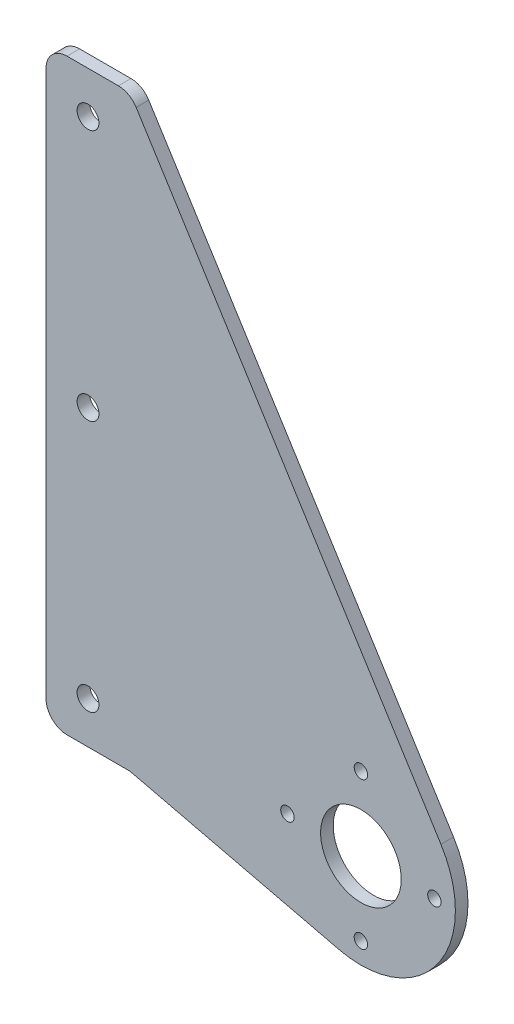
ISO-10303-21;
HEADER;
FILE_DESCRIPTION(('STEP AP214'),'2;1');
FILE_NAME('part.step','',(''),(''),'','','');
FILE_SCHEMA(('AUTOMOTIVE_DESIGN { 1 0 10303 214 1 1 1 1 }'));
ENDSEC;
DATA;
#1=APPLICATION_CONTEXT('core data for automotive mechanical design processes');
#2=APPLICATION_PROTOCOL_DEFINITION('international standard','automotive_design',2000,#1);
#3=PRODUCT_CONTEXT('',#1,'mechanical');
#4=PRODUCT('Part','Part','',(#3));
#5=PRODUCT_RELATED_PRODUCT_CATEGORY('part','',(#4));
#6=PRODUCT_DEFINITION_FORMATION('','',#4);
#7=PRODUCT_DEFINITION_CONTEXT('part definition',#1,'design');
#8=PRODUCT_DEFINITION('design','',#6,#7);
#9=PRODUCT_DEFINITION_SHAPE('','',#8);
#10=(LENGTH_UNIT() NAMED_UNIT(*) SI_UNIT(.MILLI.,.METRE.));
#11=(NAMED_UNIT(*) PLANE_ANGLE_UNIT() SI_UNIT($,.RADIAN.));
#12=(NAMED_UNIT(*) SI_UNIT($,.STERADIAN.) SOLID_ANGLE_UNIT());
#13=UNCERTAINTY_MEASURE_WITH_UNIT(LENGTH_MEASURE(1.E-05),#10,'distance_accuracy_value','');
#14=(GEOMETRIC_REPRESENTATION_CONTEXT(3) GLOBAL_UNCERTAINTY_ASSIGNED_CONTEXT((#13)) GLOBAL_UNIT_ASSIGNED_CONTEXT((#10,
#11,#12)) REPRESENTATION_CONTEXT('',''));
#15=CARTESIAN_POINT('',(0.,0.,0.));
#16=DIRECTION('',(0.,0.,1.));
#17=DIRECTION('',(1.,0.,0.));
#18=AXIS2_PLACEMENT_3D('',#15,#16,#17);
#19=CARTESIAN_POINT('',(0.,0.,3.));
#20=DIRECTION('',(0.,0.,1.));
#21=DIRECTION('',(1.,0.,0.));
#22=AXIS2_PLACEMENT_3D('',#19,#20,#21);
#23=PLANE('',#22);
#24=CARTESIAN_POINT('',(-65.,120.,3.));
#25=DIRECTION('',(0.,0.,1.));
#26=DIRECTION('',(1.,0.,0.));
#27=AXIS2_PLACEMENT_3D('',#24,#25,#26);
#28=CIRCLE('',#27,2.59999999999997);
#29=CARTESIAN_POINT('',(-62.4,120.,3.));
#30=VERTEX_POINT('',#29);
#31=EDGE_CURVE('E343',#30,#30,#28,.T.);
#32=ORIENTED_EDGE('',*,*,#31,.F.);
#33=EDGE_LOOP('',(#32));
#34=FACE_BOUND('',#33,.T.);
#35=CARTESIAN_POINT('',(-17.5,0.,3.));
#36=DIRECTION('',(0.,0.,1.));
#37=DIRECTION('',(1.,0.,0.));
#38=AXIS2_PLACEMENT_3D('',#35,#36,#37);
#39=CIRCLE('',#38,1.6);
#40=CARTESIAN_POINT('',(-15.9,0.,3.));
#41=VERTEX_POINT('',#40);
#42=EDGE_CURVE('E327',#41,#41,#39,.T.);
#43=ORIENTED_EDGE('',*,*,#42,.F.);
#44=EDGE_LOOP('',(#43));
#45=FACE_BOUND('',#44,.T.);
#46=CARTESIAN_POINT('',(17.5,0.,3.));
#47=DIRECTION('',(0.,0.,1.));
#48=DIRECTION('',(1.,0.,0.));
#49=AXIS2_PLACEMENT_3D('',#46,#47,#48);
#50=CIRCLE('',#49,1.60000000000001);
#51=CARTESIAN_POINT('',(19.1,0.,3.));
#52=VERTEX_POINT('',#51);
#53=EDGE_CURVE('E311',#52,#52,#50,.T.);
#54=ORIENTED_EDGE('',*,*,#53,.F.);
#55=EDGE_LOOP('',(#54));
#56=FACE_BOUND('',#55,.T.);
#57=CARTESIAN_POINT('',(0.,0.,3.));
#58=DIRECTION('',(0.,0.,1.));
#59=DIRECTION('',(1.,0.,0.));
#60=AXIS2_PLACEMENT_3D('',#57,#58,#59);
#61=CIRCLE('',#60,9.6);
#62=CARTESIAN_POINT('',(9.6,0.,3.));
#63=VERTEX_POINT('',#62);
#64=EDGE_CURVE('E163',#63,#63,#61,.T.);
#65=ORIENTED_EDGE('',*,*,#64,.F.);
#66=EDGE_LOOP('',(#65));
#67=FACE_BOUND('',#66,.T.);
#68=DIRECTION('',(-0.53145870163887,0.847084203873692,0.));
#69=VECTOR('',#68,1.);
#70=CARTESIAN_POINT('',(-55.,130.,3.));
#71=LINE('',#70,#69);
#72=CARTESIAN_POINT('',(19.0593945871581,11.9578207868746,3.));
#73=VERTEX_POINT('',#72);
#74=CARTESIAN_POINT('',(-53.5301912787863,127.657293508194,3.));
#75=VERTEX_POINT('',#74);
#76=EDGE_CURVE('E152',#73,#75,#71,.T.);
#77=ORIENTED_EDGE('',*,*,#76,.T.);
#78=CARTESIAN_POINT('',(-57.7656122981547,125.,3.));
#79=DIRECTION('',(0.,0.,1.));
#80=DIRECTION('',(1.,0.,0.));
#81=AXIS2_PLACEMENT_3D('',#78,#79,#80);
#82=CIRCLE('',#81,5.);
#83=CARTESIAN_POINT('',(-57.7656122981547,130.,3.));
#84=VERTEX_POINT('',#83);
#85=EDGE_CURVE('E215',#75,#84,#82,.T.);
#86=ORIENTED_EDGE('',*,*,#85,.T.);
#87=DIRECTION('',(-1.,0.,0.));
#88=VECTOR('',#87,1.);
#89=CARTESIAN_POINT('',(-75.,130.,3.));
#90=LINE('',#89,#88);
#91=CARTESIAN_POINT('',(-70.,130.,3.));
#92=VERTEX_POINT('',#91);
#93=EDGE_CURVE('E179',#84,#92,#90,.T.);
#94=ORIENTED_EDGE('',*,*,#93,.T.);
#95=CARTESIAN_POINT('',(-70.,125.,3.));
#96=DIRECTION('',(0.,0.,1.));
#97=DIRECTION('',(1.,0.,0.));
#98=AXIS2_PLACEMENT_3D('',#95,#96,#97);
#99=CIRCLE('',#98,5.);
#100=CARTESIAN_POINT('',(-75.,125.,3.));
#101=VERTEX_POINT('',#100);
#102=EDGE_CURVE('E68',#92,#101,#99,.T.);
#103=ORIENTED_EDGE('',*,*,#102,.T.);
#104=DIRECTION('',(0.,-1.,0.));
#105=VECTOR('',#104,1.);
#106=CARTESIAN_POINT('',(-75.,130.,3.));
#107=LINE('',#106,#105);
#108=CARTESIAN_POINT('',(-75.,-5.,3.));
#109=VERTEX_POINT('',#108);
#110=EDGE_CURVE('E285',#101,#109,#107,.T.);
#111=ORIENTED_EDGE('',*,*,#110,.T.);
#112=CARTESIAN_POINT('',(-70.,-5.00000000000001,3.));
#113=DIRECTION('',(0.,0.,1.));
#114=DIRECTION('',(1.,0.,0.));
#115=AXIS2_PLACEMENT_3D('',#112,#113,#114);
#116=CIRCLE('',#115,5.);
#117=CARTESIAN_POINT('',(-70.,-10.,3.));
#118=VERTEX_POINT('',#117);
#119=EDGE_CURVE('E212',#109,#118,#116,.T.);
#120=ORIENTED_EDGE('',*,*,#119,.T.);
#121=DIRECTION('',(1.,0.,0.));
#122=VECTOR('',#121,1.);
#123=CARTESIAN_POINT('',(-75.,-10.,3.));
#124=LINE('',#123,#122);
#125=CARTESIAN_POINT('',(-55.5886578882851,-10.,3.));
#126=VERTEX_POINT('',#125);
#127=EDGE_CURVE('E135',#118,#126,#124,.T.);
#128=ORIENTED_EDGE('',*,*,#127,.T.);
#129=CARTESIAN_POINT('',(-55.5886578882851,-15.,3.));
#130=DIRECTION('',(0.,0.,1.));
#131=DIRECTION('',(1.,0.,0.));
#132=AXIS2_PLACEMENT_3D('',#129,#130,#131);
#133=CIRCLE('',#132,5.);
#134=CARTESIAN_POINT('',(-54.4274374679034,-10.1367123120991,3.));
#135=VERTEX_POINT('',#134);
#136=EDGE_CURVE('E11',#126,#135,#133,.F.);
#137=ORIENTED_EDGE('',*,*,#136,.T.);
#138=DIRECTION('',(0.972657537580184,-0.23224408407633,0.));
#139=VECTOR('',#138,1.);
#140=CARTESIAN_POINT('',(-55.,-10.,3.));
#141=LINE('',#140,#139);
#142=CARTESIAN_POINT('',(-5.22549189171743,-21.8847945955541,3.));
#143=VERTEX_POINT('',#142);
#144=EDGE_CURVE('E122',#135,#143,#141,.T.);
#145=ORIENTED_EDGE('',*,*,#144,.T.);
#146=CARTESIAN_POINT('',(0.,0.,3.));
#147=DIRECTION('',(0.,0.,1.));
#148=DIRECTION('',(1.,0.,0.));
#149=AXIS2_PLACEMENT_3D('',#146,#147,#148);
#150=CIRCLE('',#149,22.5);
#151=EDGE_CURVE('E127',#143,#73,#150,.T.);
#152=ORIENTED_EDGE('',*,*,#151,.T.);
#153=EDGE_LOOP('',(#77,#86,#94,#103,#111,#120,#128,#137,#145,#152));
#154=FACE_BOUND('',#153,.T.);
#155=CARTESIAN_POINT('',(0.,17.5,3.));
#156=DIRECTION('',(0.,0.,1.));
#157=DIRECTION('',(1.,0.,0.));
#158=AXIS2_PLACEMENT_3D('',#155,#156,#157);
#159=CIRCLE('',#158,1.6);
#160=CARTESIAN_POINT('',(1.60000000000005,17.5,3.));
#161=VERTEX_POINT('',#160);
#162=EDGE_CURVE('E303',#161,#161,#159,.T.);
#163=ORIENTED_EDGE('',*,*,#162,.F.);
#164=EDGE_LOOP('',(#163));
#165=FACE_BOUND('',#164,.T.);
#166=CARTESIAN_POINT('',(0.,-17.5,3.));
#167=DIRECTION('',(0.,0.,1.));
#168=DIRECTION('',(1.,0.,0.));
#169=AXIS2_PLACEMENT_3D('',#166,#167,#168);
#170=CIRCLE('',#169,1.6);
#171=CARTESIAN_POINT('',(1.59999999999994,-17.5,3.));
#172=VERTEX_POINT('',#171);
#173=EDGE_CURVE('E319',#172,#172,#170,.T.);
#174=ORIENTED_EDGE('',*,*,#173,.F.);
#175=EDGE_LOOP('',(#174));
#176=FACE_BOUND('',#175,.T.);
#177=CARTESIAN_POINT('',(-65.,60.,3.));
#178=DIRECTION('',(0.,0.,1.));
#179=DIRECTION('',(1.,0.,0.));
#180=AXIS2_PLACEMENT_3D('',#177,#178,#179);
#181=CIRCLE('',#180,2.59999999999999);
#182=CARTESIAN_POINT('',(-62.4,60.,3.));
#183=VERTEX_POINT('',#182);
#184=EDGE_CURVE('E335',#183,#183,#181,.T.);
#185=ORIENTED_EDGE('',*,*,#184,.F.);
#186=EDGE_LOOP('',(#185));
#187=FACE_BOUND('',#186,.T.);
#188=CARTESIAN_POINT('',(-65.,0.,3.));
#189=DIRECTION('',(0.,0.,1.));
#190=DIRECTION('',(1.,0.,0.));
#191=AXIS2_PLACEMENT_3D('',#188,#189,#190);
#192=CIRCLE('',#191,2.59999999999999);
#193=CARTESIAN_POINT('',(-62.4,0.,3.));
#194=VERTEX_POINT('',#193);
#195=EDGE_CURVE('E351',#194,#194,#192,.T.);
#196=ORIENTED_EDGE('',*,*,#195,.F.);
#197=EDGE_LOOP('',(#196));
#198=FACE_BOUND('',#197,.T.);
#199=ADVANCED_FACE('F45',(#34,#45,#56,#67,#154,#165,#176,#187,#198),#23,.T.);
#200=CARTESIAN_POINT('',(0.,0.,0.));
#201=DIRECTION('',(0.,0.,1.));
#202=DIRECTION('',(1.,0.,0.));
#203=AXIS2_PLACEMENT_3D('',#200,#201,#202);
#204=PLANE('',#203);
#205=DIRECTION('',(-1.,0.,0.));
#206=VECTOR('',#205,1.);
#207=CARTESIAN_POINT('',(-75.,130.,0.));
#208=LINE('',#207,#206);
#209=CARTESIAN_POINT('',(-57.7656122981547,130.,0.));
#210=VERTEX_POINT('',#209);
#211=CARTESIAN_POINT('',(-70.,130.,0.));
#212=VERTEX_POINT('',#211);
#213=EDGE_CURVE('E158',#210,#212,#208,.T.);
#214=ORIENTED_EDGE('',*,*,#213,.F.);
#215=CARTESIAN_POINT('',(-57.7656122981547,125.,0.));
#216=DIRECTION('',(0.,0.,1.));
#217=DIRECTION('',(1.,0.,0.));
#218=AXIS2_PLACEMENT_3D('',#215,#216,#217);
#219=CIRCLE('',#218,5.);
#220=CARTESIAN_POINT('',(-53.5301912787863,127.657293508194,0.));
#221=VERTEX_POINT('',#220);
#222=EDGE_CURVE('E204',#210,#221,#219,.F.);
#223=ORIENTED_EDGE('',*,*,#222,.T.);
#224=DIRECTION('',(-0.53145870163887,0.847084203873692,0.));
#225=VECTOR('',#224,1.);
#226=CARTESIAN_POINT('',(-55.,130.,0.));
#227=LINE('',#226,#225);
#228=CARTESIAN_POINT('',(19.0593945871581,11.9578207868746,0.));
#229=VERTEX_POINT('',#228);
#230=EDGE_CURVE('E175',#229,#221,#227,.T.);
#231=ORIENTED_EDGE('',*,*,#230,.F.);
#232=CARTESIAN_POINT('',(0.,0.,0.));
#233=DIRECTION('',(0.,0.,1.));
#234=DIRECTION('',(1.,0.,0.));
#235=AXIS2_PLACEMENT_3D('',#232,#233,#234);
#236=CIRCLE('',#235,22.5);
#237=CARTESIAN_POINT('',(-5.22549189171743,-21.8847945955541,0.));
#238=VERTEX_POINT('',#237);
#239=EDGE_CURVE('E172',#238,#229,#236,.T.);
#240=ORIENTED_EDGE('',*,*,#239,.F.);
#241=DIRECTION('',(0.972657537580184,-0.23224408407633,0.));
#242=VECTOR('',#241,1.);
#243=CARTESIAN_POINT('',(-55.,-10.,0.));
#244=LINE('',#243,#242);
#245=CARTESIAN_POINT('',(-54.4274374679034,-10.1367123120991,0.));
#246=VERTEX_POINT('',#245);
#247=EDGE_CURVE('E141',#246,#238,#244,.T.);
#248=ORIENTED_EDGE('',*,*,#247,.F.);
#249=CARTESIAN_POINT('',(-55.5886578882851,-15.,0.));
#250=DIRECTION('',(0.,0.,1.));
#251=DIRECTION('',(1.,0.,0.));
#252=AXIS2_PLACEMENT_3D('',#249,#250,#251);
#253=CIRCLE('',#252,5.);
#254=CARTESIAN_POINT('',(-55.5886578882851,-10.,0.));
#255=VERTEX_POINT('',#254);
#256=EDGE_CURVE('E54',#246,#255,#253,.T.);
#257=ORIENTED_EDGE('',*,*,#256,.T.);
#258=DIRECTION('',(1.,0.,0.));
#259=VECTOR('',#258,1.);
#260=CARTESIAN_POINT('',(-75.,-10.,0.));
#261=LINE('',#260,#259);
#262=CARTESIAN_POINT('',(-70.,-10.,0.));
#263=VERTEX_POINT('',#262);
#264=EDGE_CURVE('E166',#263,#255,#261,.T.);
#265=ORIENTED_EDGE('',*,*,#264,.F.);
#266=CARTESIAN_POINT('',(-70.,-5.00000000000001,0.));
#267=DIRECTION('',(0.,0.,1.));
#268=DIRECTION('',(1.,0.,0.));
#269=AXIS2_PLACEMENT_3D('',#266,#267,#268);
#270=CIRCLE('',#269,5.);
#271=CARTESIAN_POINT('',(-75.,-5.,0.));
#272=VERTEX_POINT('',#271);
#273=EDGE_CURVE('E201',#263,#272,#270,.F.);
#274=ORIENTED_EDGE('',*,*,#273,.T.);
#275=DIRECTION('',(0.,-1.,0.));
#276=VECTOR('',#275,1.);
#277=CARTESIAN_POINT('',(-75.,130.,0.));
#278=LINE('',#277,#276);
#279=CARTESIAN_POINT('',(-75.,125.,0.));
#280=VERTEX_POINT('',#279);
#281=EDGE_CURVE('E162',#280,#272,#278,.T.);
#282=ORIENTED_EDGE('',*,*,#281,.F.);
#283=CARTESIAN_POINT('',(-70.,125.,0.));
#284=DIRECTION('',(0.,0.,1.));
#285=DIRECTION('',(1.,0.,0.));
#286=AXIS2_PLACEMENT_3D('',#283,#284,#285);
#287=CIRCLE('',#286,5.);
#288=EDGE_CURVE('E198',#280,#212,#287,.F.);
#289=ORIENTED_EDGE('',*,*,#288,.T.);
#290=EDGE_LOOP('',(#214,#223,#231,#240,#248,#257,#265,#274,#282,#289));
#291=FACE_BOUND('',#290,.T.);
#292=CARTESIAN_POINT('',(0.,0.,0.));
#293=DIRECTION('',(0.,0.,1.));
#294=DIRECTION('',(1.,0.,0.));
#295=AXIS2_PLACEMENT_3D('',#292,#293,#294);
#296=CIRCLE('',#295,9.6);
#297=CARTESIAN_POINT('',(9.6,0.,0.));
#298=VERTEX_POINT('',#297);
#299=EDGE_CURVE('E299',#298,#298,#296,.T.);
#300=ORIENTED_EDGE('',*,*,#299,.T.);
#301=EDGE_LOOP('',(#300));
#302=FACE_BOUND('',#301,.T.);
#303=CARTESIAN_POINT('',(0.,17.5,0.));
#304=DIRECTION('',(0.,0.,1.));
#305=DIRECTION('',(1.,0.,0.));
#306=AXIS2_PLACEMENT_3D('',#303,#304,#305);
#307=CIRCLE('',#306,1.6);
#308=CARTESIAN_POINT('',(1.60000000000005,17.5,0.));
#309=VERTEX_POINT('',#308);
#310=EDGE_CURVE('E307',#309,#309,#307,.T.);
#311=ORIENTED_EDGE('',*,*,#310,.T.);
#312=EDGE_LOOP('',(#311));
#313=FACE_BOUND('',#312,.T.);
#314=CARTESIAN_POINT('',(17.5,0.,0.));
#315=DIRECTION('',(0.,0.,1.));
#316=DIRECTION('',(1.,0.,0.));
#317=AXIS2_PLACEMENT_3D('',#314,#315,#316);
#318=CIRCLE('',#317,1.60000000000001);
#319=CARTESIAN_POINT('',(19.1,0.,0.));
#320=VERTEX_POINT('',#319);
#321=EDGE_CURVE('E315',#320,#320,#318,.T.);
#322=ORIENTED_EDGE('',*,*,#321,.T.);
#323=EDGE_LOOP('',(#322));
#324=FACE_BOUND('',#323,.T.);
#325=CARTESIAN_POINT('',(0.,-17.5,0.));
#326=DIRECTION('',(0.,0.,1.));
#327=DIRECTION('',(1.,0.,0.));
#328=AXIS2_PLACEMENT_3D('',#325,#326,#327);
#329=CIRCLE('',#328,1.6);
#330=CARTESIAN_POINT('',(1.59999999999994,-17.5,0.));
#331=VERTEX_POINT('',#330);
#332=EDGE_CURVE('E323',#331,#331,#329,.T.);
#333=ORIENTED_EDGE('',*,*,#332,.T.);
#334=EDGE_LOOP('',(#333));
#335=FACE_BOUND('',#334,.T.);
#336=CARTESIAN_POINT('',(-17.5,0.,0.));
#337=DIRECTION('',(0.,0.,1.));
#338=DIRECTION('',(1.,0.,0.));
#339=AXIS2_PLACEMENT_3D('',#336,#337,#338);
#340=CIRCLE('',#339,1.6);
#341=CARTESIAN_POINT('',(-15.9,0.,0.));
#342=VERTEX_POINT('',#341);
#343=EDGE_CURVE('E331',#342,#342,#340,.T.);
#344=ORIENTED_EDGE('',*,*,#343,.T.);
#345=EDGE_LOOP('',(#344));
#346=FACE_BOUND('',#345,.T.);
#347=CARTESIAN_POINT('',(-65.,60.,0.));
#348=DIRECTION('',(0.,0.,1.));
#349=DIRECTION('',(1.,0.,0.));
#350=AXIS2_PLACEMENT_3D('',#347,#348,#349);
#351=CIRCLE('',#350,2.59999999999999);
#352=CARTESIAN_POINT('',(-62.4,60.,0.));
#353=VERTEX_POINT('',#352);
#354=EDGE_CURVE('E339',#353,#353,#351,.T.);
#355=ORIENTED_EDGE('',*,*,#354,.T.);
#356=EDGE_LOOP('',(#355));
#357=FACE_BOUND('',#356,.T.);
#358=CARTESIAN_POINT('',(-65.,120.,0.));
#359=DIRECTION('',(0.,0.,1.));
#360=DIRECTION('',(1.,0.,0.));
#361=AXIS2_PLACEMENT_3D('',#358,#359,#360);
#362=CIRCLE('',#361,2.59999999999997);
#363=CARTESIAN_POINT('',(-62.4,120.,0.));
#364=VERTEX_POINT('',#363);
#365=EDGE_CURVE('E347',#364,#364,#362,.T.);
#366=ORIENTED_EDGE('',*,*,#365,.T.);
#367=EDGE_LOOP('',(#366));
#368=FACE_BOUND('',#367,.T.);
#369=CARTESIAN_POINT('',(-65.,0.,0.));
#370=DIRECTION('',(0.,0.,1.));
#371=DIRECTION('',(1.,0.,0.));
#372=AXIS2_PLACEMENT_3D('',#369,#370,#371);
#373=CIRCLE('',#372,2.59999999999999);
#374=CARTESIAN_POINT('',(-62.4,0.,0.));
#375=VERTEX_POINT('',#374);
#376=EDGE_CURVE('E355',#375,#375,#373,.T.);
#377=ORIENTED_EDGE('',*,*,#376,.T.);
#378=EDGE_LOOP('',(#377));
#379=FACE_BOUND('',#378,.T.);
#380=ADVANCED_FACE('F227',(#291,#302,#313,#324,#335,#346,#357,#368,#379),#204,.F.);
#381=CARTESIAN_POINT('',(-75.,130.,3.));
#382=DIRECTION('',(0.,-1.,0.));
#383=DIRECTION('',(0.,0.,-1.));
#384=AXIS2_PLACEMENT_3D('',#381,#382,#383);
#385=PLANE('',#384);
#386=ORIENTED_EDGE('',*,*,#93,.F.);
#387=DIRECTION('',(0.,0.,-1.));
#388=VECTOR('',#387,1.);
#389=CARTESIAN_POINT('',(-57.7656122981547,130.,3.));
#390=LINE('',#389,#388);
#391=EDGE_CURVE('E194',#84,#210,#390,.T.);
#392=ORIENTED_EDGE('',*,*,#391,.T.);
#393=ORIENTED_EDGE('',*,*,#213,.T.);
#394=DIRECTION('',(0.,0.,-1.));
#395=VECTOR('',#394,1.);
#396=CARTESIAN_POINT('',(-70.,130.,3.));
#397=LINE('',#396,#395);
#398=EDGE_CURVE('E191',#212,#92,#397,.F.);
#399=ORIENTED_EDGE('',*,*,#398,.T.);
#400=EDGE_LOOP('',(#386,#392,#393,#399));
#401=FACE_BOUND('',#400,.T.);
#402=ADVANCED_FACE('F258',(#401),#385,.F.);
#403=CARTESIAN_POINT('',(-75.,130.,3.));
#404=DIRECTION('',(1.,0.,0.));
#405=DIRECTION('',(0.,1.,0.));
#406=AXIS2_PLACEMENT_3D('',#403,#404,#405);
#407=PLANE('',#406);
#408=ORIENTED_EDGE('',*,*,#281,.T.);
#409=DIRECTION('',(0.,0.,-1.));
#410=VECTOR('',#409,1.);
#411=CARTESIAN_POINT('',(-75.,-5.,3.));
#412=LINE('',#411,#410);
#413=EDGE_CURVE('E61',#272,#109,#412,.F.);
#414=ORIENTED_EDGE('',*,*,#413,.T.);
#415=ORIENTED_EDGE('',*,*,#110,.F.);
#416=DIRECTION('',(0.,0.,-1.));
#417=VECTOR('',#416,1.);
#418=CARTESIAN_POINT('',(-75.,125.,3.));
#419=LINE('',#418,#417);
#420=EDGE_CURVE('E218',#101,#280,#419,.T.);
#421=ORIENTED_EDGE('',*,*,#420,.T.);
#422=EDGE_LOOP('',(#408,#414,#415,#421));
#423=FACE_BOUND('',#422,.T.);
#424=ADVANCED_FACE('F275',(#423),#407,.F.);
#425=CARTESIAN_POINT('',(-75.,-10.,3.));
#426=DIRECTION('',(0.,1.,0.));
#427=DIRECTION('',(-1.,0.,0.));
#428=AXIS2_PLACEMENT_3D('',#425,#426,#427);
#429=PLANE('',#428);
#430=ORIENTED_EDGE('',*,*,#264,.T.);
#431=DIRECTION('',(0.,0.,-1.));
#432=VECTOR('',#431,1.);
#433=CARTESIAN_POINT('',(-55.5886578882851,-10.,3.));
#434=LINE('',#433,#432);
#435=EDGE_CURVE('E188',#255,#126,#434,.F.);
#436=ORIENTED_EDGE('',*,*,#435,.T.);
#437=ORIENTED_EDGE('',*,*,#127,.F.);
#438=DIRECTION('',(0.,0.,-1.));
#439=VECTOR('',#438,1.);
#440=CARTESIAN_POINT('',(-70.,-10.,3.));
#441=LINE('',#440,#439);
#442=EDGE_CURVE('E184',#118,#263,#441,.T.);
#443=ORIENTED_EDGE('',*,*,#442,.T.);
#444=EDGE_LOOP('',(#430,#436,#437,#443));
#445=FACE_BOUND('',#444,.T.);
#446=ADVANCED_FACE('F232',(#445),#429,.F.);
#447=CARTESIAN_POINT('',(-55.,-10.,3.));
#448=DIRECTION('',(0.23224408407633,0.972657537580184,0.));
#449=DIRECTION('',(-0.972657537580184,0.23224408407633,0.));
#450=AXIS2_PLACEMENT_3D('',#447,#448,#449);
#451=PLANE('',#450);
#452=ORIENTED_EDGE('',*,*,#144,.F.);
#453=DIRECTION('',(0.,0.,-1.));
#454=VECTOR('',#453,1.);
#455=CARTESIAN_POINT('',(-54.4274374679034,-10.1367123120991,0.));
#456=LINE('',#455,#454);
#457=EDGE_CURVE('E145',#135,#246,#456,.T.);
#458=ORIENTED_EDGE('',*,*,#457,.T.);
#459=ORIENTED_EDGE('',*,*,#247,.T.);
#460=DIRECTION('',(0.,0.,-1.));
#461=VECTOR('',#460,1.);
#462=CARTESIAN_POINT('',(-5.22549189171743,-21.8847945955541,3.));
#463=LINE('',#462,#461);
#464=EDGE_CURVE('E138',#143,#238,#463,.T.);
#465=ORIENTED_EDGE('',*,*,#464,.F.);
#466=EDGE_LOOP('',(#452,#458,#459,#465));
#467=FACE_BOUND('',#466,.T.);
#468=ADVANCED_FACE('F139',(#467),#451,.F.);
#469=CARTESIAN_POINT('',(0.,0.,3.));
#470=DIRECTION('',(0.,0.,-1.));
#471=DIRECTION('',(-1.,0.,0.));
#472=AXIS2_PLACEMENT_3D('',#469,#470,#471);
#473=CYLINDRICAL_SURFACE('',#472,22.5);
#474=ORIENTED_EDGE('',*,*,#239,.T.);
#475=DIRECTION('',(0.,0.,-1.));
#476=VECTOR('',#475,1.);
#477=CARTESIAN_POINT('',(19.0593945871581,11.9578207868746,3.));
#478=LINE('',#477,#476);
#479=EDGE_CURVE('E146',#73,#229,#478,.T.);
#480=ORIENTED_EDGE('',*,*,#479,.F.);
#481=ORIENTED_EDGE('',*,*,#151,.F.);
#482=ORIENTED_EDGE('',*,*,#464,.T.);
#483=EDGE_LOOP('',(#474,#480,#481,#482));
#484=FACE_BOUND('',#483,.T.);
#485=ADVANCED_FACE('F148',(#484),#473,.T.);
#486=CARTESIAN_POINT('',(-55.,130.,3.));
#487=DIRECTION('',(-0.847084203873692,-0.53145870163887,0.));
#488=DIRECTION('',(0.53145870163887,-0.847084203873692,0.));
#489=AXIS2_PLACEMENT_3D('',#486,#487,#488);
#490=PLANE('',#489);
#491=ORIENTED_EDGE('',*,*,#230,.T.);
#492=DIRECTION('',(0.,0.,-1.));
#493=VECTOR('',#492,1.);
#494=CARTESIAN_POINT('',(-53.5301912787863,127.657293508194,3.));
#495=LINE('',#494,#493);
#496=EDGE_CURVE('E207',#221,#75,#495,.F.);
#497=ORIENTED_EDGE('',*,*,#496,.T.);
#498=ORIENTED_EDGE('',*,*,#76,.F.);
#499=ORIENTED_EDGE('',*,*,#479,.T.);
#500=EDGE_LOOP('',(#491,#497,#498,#499));
#501=FACE_BOUND('',#500,.T.);
#502=ADVANCED_FACE('F266',(#501),#490,.F.);
#503=CARTESIAN_POINT('',(0.,0.,3.));
#504=DIRECTION('',(0.,0.,-1.));
#505=DIRECTION('',(-1.,0.,0.));
#506=AXIS2_PLACEMENT_3D('',#503,#504,#505);
#507=CYLINDRICAL_SURFACE('',#506,9.6);
#508=ORIENTED_EDGE('',*,*,#64,.T.);
#509=EDGE_LOOP('',(#508));
#510=FACE_BOUND('',#509,.T.);
#511=ORIENTED_EDGE('',*,*,#299,.F.);
#512=EDGE_LOOP('',(#511));
#513=FACE_BOUND('',#512,.T.);
#514=ADVANCED_FACE('F263',(#510,#513),#507,.F.);
#515=CARTESIAN_POINT('',(0.,17.5,3.));
#516=DIRECTION('',(0.,0.,-1.));
#517=DIRECTION('',(-1.,0.,0.));
#518=AXIS2_PLACEMENT_3D('',#515,#516,#517);
#519=CYLINDRICAL_SURFACE('',#518,1.6);
#520=ORIENTED_EDGE('',*,*,#162,.T.);
#521=EDGE_LOOP('',(#520));
#522=FACE_BOUND('',#521,.T.);
#523=ORIENTED_EDGE('',*,*,#310,.F.);
#524=EDGE_LOOP('',(#523));
#525=FACE_BOUND('',#524,.T.);
#526=ADVANCED_FACE('F389',(#522,#525),#519,.F.);
#527=CARTESIAN_POINT('',(17.5,0.,3.));
#528=DIRECTION('',(0.,0.,-1.));
#529=DIRECTION('',(-1.,0.,0.));
#530=AXIS2_PLACEMENT_3D('',#527,#528,#529);
#531=CYLINDRICAL_SURFACE('',#530,1.60000000000001);
#532=ORIENTED_EDGE('',*,*,#53,.T.);
#533=EDGE_LOOP('',(#532));
#534=FACE_BOUND('',#533,.T.);
#535=ORIENTED_EDGE('',*,*,#321,.F.);
#536=EDGE_LOOP('',(#535));
#537=FACE_BOUND('',#536,.T.);
#538=ADVANCED_FACE('F386',(#534,#537),#531,.F.);
#539=CARTESIAN_POINT('',(0.,-17.5,3.));
#540=DIRECTION('',(0.,0.,-1.));
#541=DIRECTION('',(-1.,0.,0.));
#542=AXIS2_PLACEMENT_3D('',#539,#540,#541);
#543=CYLINDRICAL_SURFACE('',#542,1.6);
#544=ORIENTED_EDGE('',*,*,#173,.T.);
#545=EDGE_LOOP('',(#544));
#546=FACE_BOUND('',#545,.T.);
#547=ORIENTED_EDGE('',*,*,#332,.F.);
#548=EDGE_LOOP('',(#547));
#549=FACE_BOUND('',#548,.T.);
#550=ADVANCED_FACE('F382',(#546,#549),#543,.F.);
#551=CARTESIAN_POINT('',(-17.5,0.,3.));
#552=DIRECTION('',(0.,0.,-1.));
#553=DIRECTION('',(-1.,0.,0.));
#554=AXIS2_PLACEMENT_3D('',#551,#552,#553);
#555=CYLINDRICAL_SURFACE('',#554,1.6);
#556=ORIENTED_EDGE('',*,*,#42,.T.);
#557=EDGE_LOOP('',(#556));
#558=FACE_BOUND('',#557,.T.);
#559=ORIENTED_EDGE('',*,*,#343,.F.);
#560=EDGE_LOOP('',(#559));
#561=FACE_BOUND('',#560,.T.);
#562=ADVANCED_FACE('F376',(#558,#561),#555,.F.);
#563=CARTESIAN_POINT('',(-65.,60.,3.));
#564=DIRECTION('',(0.,0.,-1.));
#565=DIRECTION('',(-1.,0.,0.));
#566=AXIS2_PLACEMENT_3D('',#563,#564,#565);
#567=CYLINDRICAL_SURFACE('',#566,2.59999999999999);
#568=ORIENTED_EDGE('',*,*,#184,.T.);
#569=EDGE_LOOP('',(#568));
#570=FACE_BOUND('',#569,.T.);
#571=ORIENTED_EDGE('',*,*,#354,.F.);
#572=EDGE_LOOP('',(#571));
#573=FACE_BOUND('',#572,.T.);
#574=ADVANCED_FACE('F369',(#570,#573),#567,.F.);
#575=CARTESIAN_POINT('',(-65.,120.,3.));
#576=DIRECTION('',(0.,0.,-1.));
#577=DIRECTION('',(-1.,0.,0.));
#578=AXIS2_PLACEMENT_3D('',#575,#576,#577);
#579=CYLINDRICAL_SURFACE('',#578,2.59999999999997);
#580=ORIENTED_EDGE('',*,*,#31,.T.);
#581=EDGE_LOOP('',(#580));
#582=FACE_BOUND('',#581,.T.);
#583=ORIENTED_EDGE('',*,*,#365,.F.);
#584=EDGE_LOOP('',(#583));
#585=FACE_BOUND('',#584,.T.);
#586=ADVANCED_FACE('F248',(#582,#585),#579,.F.);
#587=CARTESIAN_POINT('',(-65.,0.,3.));
#588=DIRECTION('',(0.,0.,-1.));
#589=DIRECTION('',(-1.,0.,0.));
#590=AXIS2_PLACEMENT_3D('',#587,#588,#589);
#591=CYLINDRICAL_SURFACE('',#590,2.59999999999999);
#592=ORIENTED_EDGE('',*,*,#195,.T.);
#593=EDGE_LOOP('',(#592));
#594=FACE_BOUND('',#593,.T.);
#595=ORIENTED_EDGE('',*,*,#376,.F.);
#596=EDGE_LOOP('',(#595));
#597=FACE_BOUND('',#596,.T.);
#598=ADVANCED_FACE('F238',(#594,#597),#591,.F.);
#599=CARTESIAN_POINT('',(-55.5886578882851,-15.,3.));
#600=DIRECTION('',(0.,0.,1.));
#601=DIRECTION('',(1.,0.,0.));
#602=AXIS2_PLACEMENT_3D('',#599,#600,#601);
#603=CYLINDRICAL_SURFACE('',#602,5.);
#604=ORIENTED_EDGE('',*,*,#136,.F.);
#605=ORIENTED_EDGE('',*,*,#435,.F.);
#606=ORIENTED_EDGE('',*,*,#256,.F.);
#607=ORIENTED_EDGE('',*,*,#457,.F.);
#608=EDGE_LOOP('',(#604,#605,#606,#607));
#609=FACE_BOUND('',#608,.T.);
#610=ADVANCED_FACE('F235',(#609),#603,.F.);
#611=CARTESIAN_POINT('',(-57.7656122981547,125.,3.));
#612=DIRECTION('',(0.,0.,-1.));
#613=DIRECTION('',(-1.,0.,0.));
#614=AXIS2_PLACEMENT_3D('',#611,#612,#613);
#615=CYLINDRICAL_SURFACE('',#614,5.);
#616=ORIENTED_EDGE('',*,*,#85,.F.);
#617=ORIENTED_EDGE('',*,*,#496,.F.);
#618=ORIENTED_EDGE('',*,*,#222,.F.);
#619=ORIENTED_EDGE('',*,*,#391,.F.);
#620=EDGE_LOOP('',(#616,#617,#618,#619));
#621=FACE_BOUND('',#620,.T.);
#622=ADVANCED_FACE('F237',(#621),#615,.T.);
#623=CARTESIAN_POINT('',(-70.,-5.00000000000001,3.));
#624=DIRECTION('',(0.,0.,-1.));
#625=DIRECTION('',(-1.,0.,0.));
#626=AXIS2_PLACEMENT_3D('',#623,#624,#625);
#627=CYLINDRICAL_SURFACE('',#626,5.);
#628=ORIENTED_EDGE('',*,*,#119,.F.);
#629=ORIENTED_EDGE('',*,*,#413,.F.);
#630=ORIENTED_EDGE('',*,*,#273,.F.);
#631=ORIENTED_EDGE('',*,*,#442,.F.);
#632=EDGE_LOOP('',(#628,#629,#630,#631));
#633=FACE_BOUND('',#632,.T.);
#634=ADVANCED_FACE('F244',(#633),#627,.T.);
#635=CARTESIAN_POINT('',(-70.,125.,3.));
#636=DIRECTION('',(0.,0.,-1.));
#637=DIRECTION('',(-1.,0.,0.));
#638=AXIS2_PLACEMENT_3D('',#635,#636,#637);
#639=CYLINDRICAL_SURFACE('',#638,5.);
#640=ORIENTED_EDGE('',*,*,#102,.F.);
#641=ORIENTED_EDGE('',*,*,#398,.F.);
#642=ORIENTED_EDGE('',*,*,#288,.F.);
#643=ORIENTED_EDGE('',*,*,#420,.F.);
#644=EDGE_LOOP('',(#640,#641,#642,#643));
#645=FACE_BOUND('',#644,.T.);
#646=ADVANCED_FACE('F47',(#645),#639,.T.);
#647=CLOSED_SHELL('',(#199,#380,#402,#424,#446,#468,#485,#502,#514,#526,#538,#550,#562,#574,
#586,#598,#610,#622,#634,#646));
#648=MANIFOLD_SOLID_BREP('B2',#647);
#649=ADVANCED_BREP_SHAPE_REPRESENTATION('',(#18,#648),#14);
#650=SHAPE_DEFINITION_REPRESENTATION(#9,#649);
ENDSEC;
END-ISO-10303-21;
